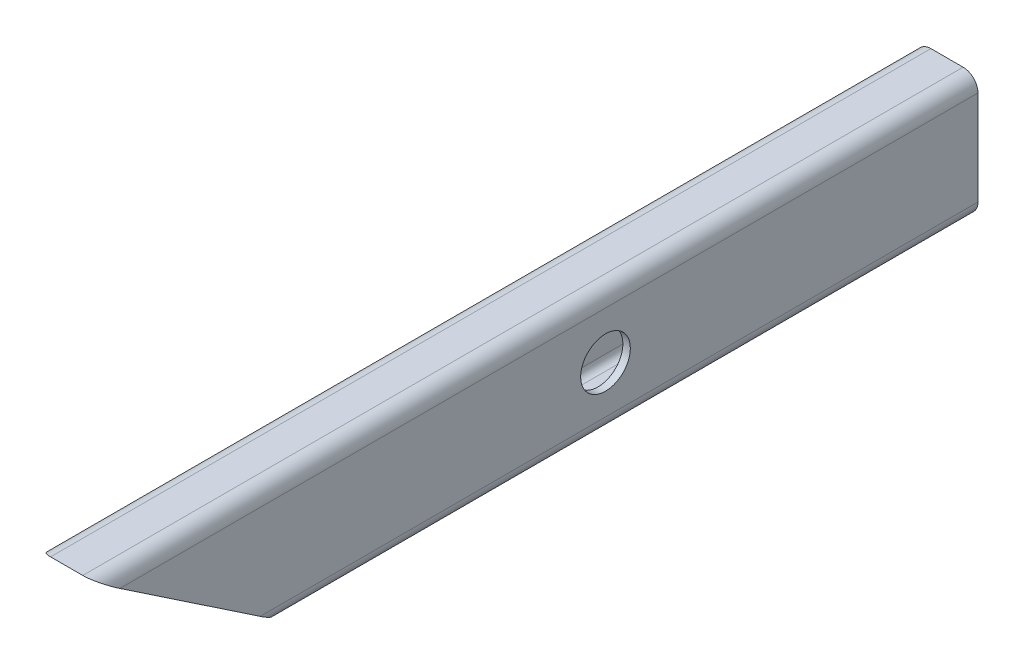
ISO-10303-21;
HEADER;
FILE_DESCRIPTION(('STEP AP214'),'2;1');
FILE_NAME('part.step','',(''),(''),'','','');
FILE_SCHEMA(('AUTOMOTIVE_DESIGN { 1 0 10303 214 1 1 1 1 }'));
ENDSEC;
DATA;
#1=APPLICATION_CONTEXT('core data for automotive mechanical design processes');
#2=APPLICATION_PROTOCOL_DEFINITION('international standard','automotive_design',2000,#1);
#3=PRODUCT_CONTEXT('',#1,'mechanical');
#4=PRODUCT('Part','Part','',(#3));
#5=PRODUCT_RELATED_PRODUCT_CATEGORY('part','',(#4));
#6=PRODUCT_DEFINITION_FORMATION('','',#4);
#7=PRODUCT_DEFINITION_CONTEXT('part definition',#1,'design');
#8=PRODUCT_DEFINITION('design','',#6,#7);
#9=PRODUCT_DEFINITION_SHAPE('','',#8);
#10=(LENGTH_UNIT() NAMED_UNIT(*) SI_UNIT(.MILLI.,.METRE.));
#11=(NAMED_UNIT(*) PLANE_ANGLE_UNIT() SI_UNIT($,.RADIAN.));
#12=(NAMED_UNIT(*) SI_UNIT($,.STERADIAN.) SOLID_ANGLE_UNIT());
#13=UNCERTAINTY_MEASURE_WITH_UNIT(LENGTH_MEASURE(1.E-05),#10,'distance_accuracy_value','');
#14=(GEOMETRIC_REPRESENTATION_CONTEXT(3) GLOBAL_UNCERTAINTY_ASSIGNED_CONTEXT((#13)) GLOBAL_UNIT_ASSIGNED_CONTEXT((#10,
#11,#12)) REPRESENTATION_CONTEXT('',''));
#15=CARTESIAN_POINT('',(0.,0.,0.));
#16=DIRECTION('',(0.,0.,1.));
#17=DIRECTION('',(1.,0.,0.));
#18=AXIS2_PLACEMENT_3D('',#15,#16,#17);
#19=CARTESIAN_POINT('',(6.,6.,356.5));
#20=DIRECTION('',(0.,0.,-1.));
#21=DIRECTION('',(-1.,0.,0.));
#22=AXIS2_PLACEMENT_3D('',#19,#20,#21);
#23=CYLINDRICAL_SURFACE('',#22,6.);
#24=CARTESIAN_POINT('',(6.,6.,289.040797450636));
#25=DIRECTION('',(0.,-0.829934558297363,0.557860761251193));
#26=DIRECTION('',(0.,-0.557860761251193,-0.829934558297364));
#27=AXIS2_PLACEMENT_3D('',#24,#25,#26);
#28=ELLIPSE('',#27,10.7553719794577,6.);
#29=CARTESIAN_POINT('',(0.,5.99999999999998,289.040797450636));
#30=VERTEX_POINT('',#29);
#31=CARTESIAN_POINT('',(6.,0.,280.114542557541));
#32=VERTEX_POINT('',#31);
#33=EDGE_CURVE('E266',#30,#32,#28,.T.);
#34=ORIENTED_EDGE('',*,*,#33,.F.);
#35=DIRECTION('',(0.,0.,-1.));
#36=VECTOR('',#35,1.);
#37=CARTESIAN_POINT('',(0.,6.,356.5));
#38=LINE('',#37,#36);
#39=CARTESIAN_POINT('',(0.,6.,0.));
#40=VERTEX_POINT('',#39);
#41=EDGE_CURVE('E206',#30,#40,#38,.T.);
#42=ORIENTED_EDGE('',*,*,#41,.T.);
#43=CARTESIAN_POINT('',(6.,6.,0.));
#44=DIRECTION('',(0.,0.,1.));
#45=DIRECTION('',(-1.,0.,0.));
#46=AXIS2_PLACEMENT_3D('',#43,#44,#45);
#47=CIRCLE('',#46,6.);
#48=CARTESIAN_POINT('',(6.,0.,0.));
#49=VERTEX_POINT('',#48);
#50=EDGE_CURVE('E201',#40,#49,#47,.T.);
#51=ORIENTED_EDGE('',*,*,#50,.T.);
#52=DIRECTION('',(0.,0.,-1.));
#53=VECTOR('',#52,1.);
#54=CARTESIAN_POINT('',(6.,0.,356.5));
#55=LINE('',#54,#53);
#56=EDGE_CURVE('E47',#32,#49,#55,.T.);
#57=ORIENTED_EDGE('',*,*,#56,.F.);
#58=EDGE_LOOP('',(#34,#42,#51,#57));
#59=FACE_BOUND('',#58,.T.);
#60=ADVANCED_FACE('F39',(#59),#23,.T.);
#61=CARTESIAN_POINT('',(6.,0.,356.5));
#62=DIRECTION('',(0.,1.,0.));
#63=DIRECTION('',(0.,0.,1.));
#64=AXIS2_PLACEMENT_3D('',#61,#62,#63);
#65=PLANE('',#64);
#66=DIRECTION('',(1.,0.,0.));
#67=VECTOR('',#66,1.);
#68=CARTESIAN_POINT('',(0.,0.,280.114542557541));
#69=LINE('',#68,#67);
#70=CARTESIAN_POINT('',(18.9611964303452,0.,280.114542557541));
#71=VERTEX_POINT('',#70);
#72=EDGE_CURVE('E192',#32,#71,#69,.T.);
#73=ORIENTED_EDGE('',*,*,#72,.F.);
#74=ORIENTED_EDGE('',*,*,#56,.T.);
#75=DIRECTION('',(1.,0.,0.));
#76=VECTOR('',#75,1.);
#77=CARTESIAN_POINT('',(6.,0.,0.));
#78=LINE('',#77,#76);
#79=CARTESIAN_POINT('',(18.9611964303452,0.,0.));
#80=VERTEX_POINT('',#79);
#81=EDGE_CURVE('E190',#49,#80,#78,.T.);
#82=ORIENTED_EDGE('',*,*,#81,.T.);
#83=DIRECTION('',(0.,0.,-1.));
#84=VECTOR('',#83,1.);
#85=CARTESIAN_POINT('',(18.9611964303452,0.,356.5));
#86=LINE('',#85,#84);
#87=EDGE_CURVE('E176',#71,#80,#86,.T.);
#88=ORIENTED_EDGE('',*,*,#87,.F.);
#89=EDGE_LOOP('',(#73,#74,#82,#88));
#90=FACE_BOUND('',#89,.T.);
#91=ADVANCED_FACE('F188',(#90),#65,.F.);
#92=CARTESIAN_POINT('',(18.9611964303452,6.,356.5));
#93=DIRECTION('',(0.,0.,-1.));
#94=DIRECTION('',(-1.,0.,0.));
#95=AXIS2_PLACEMENT_3D('',#92,#93,#94);
#96=CYLINDRICAL_SURFACE('',#95,6.);
#97=CARTESIAN_POINT('',(18.9611964303452,6.,289.040797450636));
#98=DIRECTION('',(0.,-0.829934558297363,0.557860761251193));
#99=DIRECTION('',(0.,-0.557860761251193,-0.829934558297364));
#100=AXIS2_PLACEMENT_3D('',#97,#98,#99);
#101=ELLIPSE('',#100,10.7553719794577,6.);
#102=CARTESIAN_POINT('',(24.9611964303452,5.99999999999998,289.040797450636));
#103=VERTEX_POINT('',#102);
#104=EDGE_CURVE('E155',#71,#103,#101,.T.);
#105=ORIENTED_EDGE('',*,*,#104,.F.);
#106=ORIENTED_EDGE('',*,*,#87,.T.);
#107=CARTESIAN_POINT('',(18.9611964303452,6.,0.));
#108=DIRECTION('',(0.,0.,1.));
#109=DIRECTION('',(1.,0.,0.));
#110=AXIS2_PLACEMENT_3D('',#107,#108,#109);
#111=CIRCLE('',#110,6.);
#112=CARTESIAN_POINT('',(24.9611964303452,6.,0.));
#113=VERTEX_POINT('',#112);
#114=EDGE_CURVE('E203',#80,#113,#111,.T.);
#115=ORIENTED_EDGE('',*,*,#114,.T.);
#116=DIRECTION('',(0.,0.,-1.));
#117=VECTOR('',#116,1.);
#118=CARTESIAN_POINT('',(24.9611964303452,6.,356.5));
#119=LINE('',#118,#117);
#120=EDGE_CURVE('E174',#103,#113,#119,.T.);
#121=ORIENTED_EDGE('',*,*,#120,.F.);
#122=EDGE_LOOP('',(#105,#106,#115,#121));
#123=FACE_BOUND('',#122,.T.);
#124=ADVANCED_FACE('F349',(#123),#96,.T.);
#125=CARTESIAN_POINT('',(24.9611964303453,44.,356.5));
#126=DIRECTION('',(-1.,0.,0.));
#127=DIRECTION('',(0.,-1.,0.));
#128=AXIS2_PLACEMENT_3D('',#125,#126,#127);
#129=PLANE('',#128);
#130=CARTESIAN_POINT('',(24.9611964303452,25.,150.));
#131=DIRECTION('',(1.,0.,0.));
#132=DIRECTION('',(0.,1.,0.));
#133=AXIS2_PLACEMENT_3D('',#130,#131,#132);
#134=CIRCLE('',#133,10.);
#135=CARTESIAN_POINT('',(24.9611964303453,35.,150.));
#136=VERTEX_POINT('',#135);
#137=EDGE_CURVE('E471',#136,#136,#134,.T.);
#138=ORIENTED_EDGE('',*,*,#137,.F.);
#139=EDGE_LOOP('',(#138));
#140=FACE_BOUND('',#139,.T.);
#141=DIRECTION('',(0.,-0.557860761251193,-0.829934558297364));
#142=VECTOR('',#141,1.);
#143=CARTESIAN_POINT('',(24.9611964303452,-129.689650675504,87.1740627365411));
#144=LINE('',#143,#142);
#145=CARTESIAN_POINT('',(24.9611964303453,44.0000000000001,345.573745106905));
#146=VERTEX_POINT('',#145);
#147=EDGE_CURVE('E149',#146,#103,#144,.T.);
#148=ORIENTED_EDGE('',*,*,#147,.T.);
#149=ORIENTED_EDGE('',*,*,#120,.T.);
#150=DIRECTION('',(0.,1.,0.));
#151=VECTOR('',#150,1.);
#152=CARTESIAN_POINT('',(24.9611964303453,44.,0.));
#153=LINE('',#152,#151);
#154=CARTESIAN_POINT('',(24.9611964303453,44.,0.));
#155=VERTEX_POINT('',#154);
#156=EDGE_CURVE('E172',#113,#155,#153,.T.);
#157=ORIENTED_EDGE('',*,*,#156,.T.);
#158=DIRECTION('',(0.,0.,-1.));
#159=VECTOR('',#158,1.);
#160=CARTESIAN_POINT('',(24.9611964303453,44.,356.5));
#161=LINE('',#160,#159);
#162=EDGE_CURVE('E166',#146,#155,#161,.T.);
#163=ORIENTED_EDGE('',*,*,#162,.F.);
#164=EDGE_LOOP('',(#148,#149,#157,#163));
#165=FACE_BOUND('',#164,.T.);
#166=ADVANCED_FACE('F170',(#140,#165),#129,.F.);
#167=CARTESIAN_POINT('',(18.9611964303452,44.,356.5));
#168=DIRECTION('',(0.,0.,-1.));
#169=DIRECTION('',(-1.,0.,0.));
#170=AXIS2_PLACEMENT_3D('',#167,#168,#169);
#171=CYLINDRICAL_SURFACE('',#170,6.00000000000001);
#172=CARTESIAN_POINT('',(18.9611964303452,44.,345.573745106905));
#173=DIRECTION('',(0.,-0.829934558297363,0.557860761251193));
#174=DIRECTION('',(0.,-0.557860761251193,-0.829934558297364));
#175=AXIS2_PLACEMENT_3D('',#172,#173,#174);
#176=ELLIPSE('',#175,10.7553719794577,6.00000000000001);
#177=CARTESIAN_POINT('',(18.9611964303453,50.,354.5));
#178=VERTEX_POINT('',#177);
#179=EDGE_CURVE('E152',#146,#178,#176,.T.);
#180=ORIENTED_EDGE('',*,*,#179,.F.);
#181=ORIENTED_EDGE('',*,*,#162,.T.);
#182=CARTESIAN_POINT('',(18.9611964303452,44.,0.));
#183=DIRECTION('',(0.,0.,1.));
#184=DIRECTION('',(-1.,0.,0.));
#185=AXIS2_PLACEMENT_3D('',#182,#183,#184);
#186=CIRCLE('',#185,6.00000000000001);
#187=CARTESIAN_POINT('',(18.9611964303452,50.,0.));
#188=VERTEX_POINT('',#187);
#189=EDGE_CURVE('E216',#155,#188,#186,.T.);
#190=ORIENTED_EDGE('',*,*,#189,.T.);
#191=DIRECTION('',(0.,0.,-1.));
#192=VECTOR('',#191,1.);
#193=CARTESIAN_POINT('',(18.9611964303452,50.,356.5));
#194=LINE('',#193,#192);
#195=EDGE_CURVE('E168',#178,#188,#194,.T.);
#196=ORIENTED_EDGE('',*,*,#195,.F.);
#197=EDGE_LOOP('',(#180,#181,#190,#196));
#198=FACE_BOUND('',#197,.T.);
#199=ADVANCED_FACE('F164',(#198),#171,.T.);
#200=CARTESIAN_POINT('',(6.,50.,356.5));
#201=DIRECTION('',(0.,-1.,0.));
#202=DIRECTION('',(0.,0.,-1.));
#203=AXIS2_PLACEMENT_3D('',#200,#201,#202);
#204=PLANE('',#203);
#205=DIRECTION('',(1.,0.,0.));
#206=VECTOR('',#205,1.);
#207=CARTESIAN_POINT('',(0.,50.,354.5));
#208=LINE('',#207,#206);
#209=CARTESIAN_POINT('',(6.,50.,354.5));
#210=VERTEX_POINT('',#209);
#211=EDGE_CURVE('E238',#210,#178,#208,.T.);
#212=ORIENTED_EDGE('',*,*,#211,.T.);
#213=ORIENTED_EDGE('',*,*,#195,.T.);
#214=DIRECTION('',(-1.,0.,0.));
#215=VECTOR('',#214,1.);
#216=CARTESIAN_POINT('',(6.,50.,0.));
#217=LINE('',#216,#215);
#218=CARTESIAN_POINT('',(6.,50.,0.));
#219=VERTEX_POINT('',#218);
#220=EDGE_CURVE('E218',#188,#219,#217,.T.);
#221=ORIENTED_EDGE('',*,*,#220,.T.);
#222=DIRECTION('',(0.,0.,-1.));
#223=VECTOR('',#222,1.);
#224=CARTESIAN_POINT('',(6.,50.,356.5));
#225=LINE('',#224,#223);
#226=EDGE_CURVE('E178',#210,#219,#225,.T.);
#227=ORIENTED_EDGE('',*,*,#226,.F.);
#228=EDGE_LOOP('',(#212,#213,#221,#227));
#229=FACE_BOUND('',#228,.T.);
#230=ADVANCED_FACE('F235',(#229),#204,.F.);
#231=CARTESIAN_POINT('',(6.,44.,356.5));
#232=DIRECTION('',(0.,0.,-1.));
#233=DIRECTION('',(-1.,0.,0.));
#234=AXIS2_PLACEMENT_3D('',#231,#232,#233);
#235=CYLINDRICAL_SURFACE('',#234,6.);
#236=CARTESIAN_POINT('',(6.,44.,345.573745106905));
#237=DIRECTION('',(0.,-0.829934558297363,0.557860761251193));
#238=DIRECTION('',(0.,-0.557860761251193,-0.829934558297364));
#239=AXIS2_PLACEMENT_3D('',#236,#237,#238);
#240=ELLIPSE('',#239,10.7553719794577,6.);
#241=CARTESIAN_POINT('',(0.,44.,345.573745106905));
#242=VERTEX_POINT('',#241);
#243=EDGE_CURVE('E54',#210,#242,#240,.T.);
#244=ORIENTED_EDGE('',*,*,#243,.F.);
#245=ORIENTED_EDGE('',*,*,#226,.T.);
#246=CARTESIAN_POINT('',(6.,44.,0.));
#247=DIRECTION('',(0.,0.,1.));
#248=DIRECTION('',(1.,0.,0.));
#249=AXIS2_PLACEMENT_3D('',#246,#247,#248);
#250=CIRCLE('',#249,6.);
#251=CARTESIAN_POINT('',(0.,44.,0.));
#252=VERTEX_POINT('',#251);
#253=EDGE_CURVE('E221',#219,#252,#250,.T.);
#254=ORIENTED_EDGE('',*,*,#253,.T.);
#255=DIRECTION('',(0.,0.,-1.));
#256=VECTOR('',#255,1.);
#257=CARTESIAN_POINT('',(0.,44.,356.5));
#258=LINE('',#257,#256);
#259=EDGE_CURVE('E227',#242,#252,#258,.T.);
#260=ORIENTED_EDGE('',*,*,#259,.F.);
#261=EDGE_LOOP('',(#244,#245,#254,#260));
#262=FACE_BOUND('',#261,.T.);
#263=ADVANCED_FACE('F230',(#262),#235,.T.);
#264=CARTESIAN_POINT('',(0.,44.,356.5));
#265=DIRECTION('',(1.,0.,0.));
#266=DIRECTION('',(0.,0.,-1.));
#267=AXIS2_PLACEMENT_3D('',#264,#265,#266);
#268=PLANE('',#267);
#269=CARTESIAN_POINT('',(0.,25.,150.));
#270=DIRECTION('',(1.,0.,0.));
#271=DIRECTION('',(0.,1.,0.));
#272=AXIS2_PLACEMENT_3D('',#269,#270,#271);
#273=CIRCLE('',#272,10.);
#274=CARTESIAN_POINT('',(0.,35.,150.));
#275=VERTEX_POINT('',#274);
#276=EDGE_CURVE('E472',#275,#275,#273,.T.);
#277=ORIENTED_EDGE('',*,*,#276,.T.);
#278=EDGE_LOOP('',(#277));
#279=FACE_BOUND('',#278,.T.);
#280=DIRECTION('',(0.,-0.557860761251193,-0.829934558297364));
#281=VECTOR('',#280,1.);
#282=CARTESIAN_POINT('',(0.,-129.689650675504,87.1740627365411));
#283=LINE('',#282,#281);
#284=EDGE_CURVE('E159',#242,#30,#283,.T.);
#285=ORIENTED_EDGE('',*,*,#284,.F.);
#286=ORIENTED_EDGE('',*,*,#259,.T.);
#287=DIRECTION('',(0.,-1.,0.));
#288=VECTOR('',#287,1.);
#289=CARTESIAN_POINT('',(0.,44.,0.));
#290=LINE('',#289,#288);
#291=EDGE_CURVE('E224',#252,#40,#290,.T.);
#292=ORIENTED_EDGE('',*,*,#291,.T.);
#293=ORIENTED_EDGE('',*,*,#41,.F.);
#294=EDGE_LOOP('',(#285,#286,#292,#293));
#295=FACE_BOUND('',#294,.T.);
#296=ADVANCED_FACE('F237',(#279,#295),#268,.F.);
#297=CARTESIAN_POINT('',(6.,6.,356.5));
#298=DIRECTION('',(0.,0.,-1.));
#299=DIRECTION('',(-1.,0.,0.));
#300=AXIS2_PLACEMENT_3D('',#297,#298,#299);
#301=CYLINDRICAL_SURFACE('',#300,3.);
#302=DIRECTION('',(0.,0.,-1.));
#303=VECTOR('',#302,1.);
#304=CARTESIAN_POINT('',(3.,6.,356.5));
#305=LINE('',#304,#303);
#306=CARTESIAN_POINT('',(3.,6.,289.040797450636));
#307=VERTEX_POINT('',#306);
#308=CARTESIAN_POINT('',(3.,6.,0.));
#309=VERTEX_POINT('',#308);
#310=EDGE_CURVE('E292',#307,#309,#305,.T.);
#311=ORIENTED_EDGE('',*,*,#310,.F.);
#312=CARTESIAN_POINT('',(6.,6.,289.040797450636));
#313=DIRECTION('',(0.,-0.829934558297363,0.557860761251193));
#314=DIRECTION('',(0.,-0.557860761251193,-0.829934558297364));
#315=AXIS2_PLACEMENT_3D('',#312,#313,#314);
#316=ELLIPSE('',#315,5.37768598972883,3.);
#317=CARTESIAN_POINT('',(6.,3.,284.577670004089));
#318=VERTEX_POINT('',#317);
#319=EDGE_CURVE('E62',#307,#318,#316,.T.);
#320=ORIENTED_EDGE('',*,*,#319,.T.);
#321=DIRECTION('',(0.,0.,-1.));
#322=VECTOR('',#321,1.);
#323=CARTESIAN_POINT('',(6.,3.,356.5));
#324=LINE('',#323,#322);
#325=CARTESIAN_POINT('',(6.,3.,0.));
#326=VERTEX_POINT('',#325);
#327=EDGE_CURVE('E208',#318,#326,#324,.T.);
#328=ORIENTED_EDGE('',*,*,#327,.T.);
#329=CARTESIAN_POINT('',(6.,6.,0.));
#330=DIRECTION('',(0.,0.,1.));
#331=DIRECTION('',(-1.,0.,0.));
#332=AXIS2_PLACEMENT_3D('',#329,#330,#331);
#333=CIRCLE('',#332,3.);
#334=EDGE_CURVE('E268',#309,#326,#333,.T.);
#335=ORIENTED_EDGE('',*,*,#334,.F.);
#336=EDGE_LOOP('',(#311,#320,#328,#335));
#337=FACE_BOUND('',#336,.T.);
#338=ADVANCED_FACE('F317',(#337),#301,.F.);
#339=CARTESIAN_POINT('',(6.,3.,356.5));
#340=DIRECTION('',(0.,1.,0.));
#341=DIRECTION('',(0.,0.,1.));
#342=AXIS2_PLACEMENT_3D('',#339,#340,#341);
#343=PLANE('',#342);
#344=ORIENTED_EDGE('',*,*,#327,.F.);
#345=DIRECTION('',(1.,0.,0.));
#346=VECTOR('',#345,1.);
#347=CARTESIAN_POINT('',(6.00000000000002,3.,284.577670004089));
#348=LINE('',#347,#346);
#349=CARTESIAN_POINT('',(18.9611964303452,3.,284.577670004089));
#350=VERTEX_POINT('',#349);
#351=EDGE_CURVE('E260',#318,#350,#348,.T.);
#352=ORIENTED_EDGE('',*,*,#351,.T.);
#353=DIRECTION('',(0.,0.,-1.));
#354=VECTOR('',#353,1.);
#355=CARTESIAN_POINT('',(18.9611964303452,3.,356.5));
#356=LINE('',#355,#354);
#357=CARTESIAN_POINT('',(18.9611964303452,3.,0.));
#358=VERTEX_POINT('',#357);
#359=EDGE_CURVE('E210',#350,#358,#356,.T.);
#360=ORIENTED_EDGE('',*,*,#359,.T.);
#361=DIRECTION('',(1.,0.,0.));
#362=VECTOR('',#361,1.);
#363=CARTESIAN_POINT('',(6.,3.,0.));
#364=LINE('',#363,#362);
#365=EDGE_CURVE('E271',#326,#358,#364,.T.);
#366=ORIENTED_EDGE('',*,*,#365,.F.);
#367=EDGE_LOOP('',(#344,#352,#360,#366));
#368=FACE_BOUND('',#367,.T.);
#369=ADVANCED_FACE('F308',(#368),#343,.T.);
#370=CARTESIAN_POINT('',(18.9611964303452,6.,356.5));
#371=DIRECTION('',(0.,0.,-1.));
#372=DIRECTION('',(-1.,0.,0.));
#373=AXIS2_PLACEMENT_3D('',#370,#371,#372);
#374=CYLINDRICAL_SURFACE('',#373,3.);
#375=ORIENTED_EDGE('',*,*,#359,.F.);
#376=CARTESIAN_POINT('',(18.9611964303452,6.,289.040797450636));
#377=DIRECTION('',(0.,-0.829934558297363,0.557860761251193));
#378=DIRECTION('',(0.,-0.557860761251193,-0.829934558297364));
#379=AXIS2_PLACEMENT_3D('',#376,#377,#378);
#380=ELLIPSE('',#379,5.37768598972883,3.);
#381=CARTESIAN_POINT('',(21.9611964303452,6.00000000000001,289.040797450636));
#382=VERTEX_POINT('',#381);
#383=EDGE_CURVE('E257',#350,#382,#380,.T.);
#384=ORIENTED_EDGE('',*,*,#383,.T.);
#385=DIRECTION('',(0.,0.,-1.));
#386=VECTOR('',#385,1.);
#387=CARTESIAN_POINT('',(21.9611964303452,6.,356.5));
#388=LINE('',#387,#386);
#389=CARTESIAN_POINT('',(21.9611964303452,6.,0.));
#390=VERTEX_POINT('',#389);
#391=EDGE_CURVE('E302',#382,#390,#388,.T.);
#392=ORIENTED_EDGE('',*,*,#391,.T.);
#393=CARTESIAN_POINT('',(18.9611964303452,6.,0.));
#394=DIRECTION('',(0.,0.,1.));
#395=DIRECTION('',(1.,0.,0.));
#396=AXIS2_PLACEMENT_3D('',#393,#394,#395);
#397=CIRCLE('',#396,3.);
#398=EDGE_CURVE('E274',#358,#390,#397,.T.);
#399=ORIENTED_EDGE('',*,*,#398,.F.);
#400=EDGE_LOOP('',(#375,#384,#392,#399));
#401=FACE_BOUND('',#400,.T.);
#402=ADVANCED_FACE('F310',(#401),#374,.F.);
#403=CARTESIAN_POINT('',(21.9611964303452,44.,356.5));
#404=DIRECTION('',(-1.,0.,0.));
#405=DIRECTION('',(0.,0.,1.));
#406=AXIS2_PLACEMENT_3D('',#403,#404,#405);
#407=PLANE('',#406);
#408=CARTESIAN_POINT('',(21.9611964303452,25.,150.));
#409=DIRECTION('',(-1.,0.,0.));
#410=DIRECTION('',(0.,0.,1.));
#411=AXIS2_PLACEMENT_3D('',#408,#409,#410);
#412=CIRCLE('',#411,10.);
#413=CARTESIAN_POINT('',(21.9611964303452,25.,160.));
#414=VERTEX_POINT('',#413);
#415=EDGE_CURVE('E160',#414,#414,#412,.T.);
#416=ORIENTED_EDGE('',*,*,#415,.F.);
#417=EDGE_LOOP('',(#416));
#418=FACE_BOUND('',#417,.T.);
#419=ORIENTED_EDGE('',*,*,#391,.F.);
#420=DIRECTION('',(0.,0.557860761251193,0.829934558297363));
#421=VECTOR('',#420,1.);
#422=CARTESIAN_POINT('',(21.9611964303452,49.0587240752983,353.09965519523));
#423=LINE('',#422,#421);
#424=CARTESIAN_POINT('',(21.9611964303452,44.,345.573745106905));
#425=VERTEX_POINT('',#424);
#426=EDGE_CURVE('E254',#382,#425,#423,.T.);
#427=ORIENTED_EDGE('',*,*,#426,.T.);
#428=DIRECTION('',(0.,0.,-1.));
#429=VECTOR('',#428,1.);
#430=CARTESIAN_POINT('',(21.9611964303452,44.,356.5));
#431=LINE('',#430,#429);
#432=CARTESIAN_POINT('',(21.9611964303452,44.,0.));
#433=VERTEX_POINT('',#432);
#434=EDGE_CURVE('E300',#425,#433,#431,.T.);
#435=ORIENTED_EDGE('',*,*,#434,.T.);
#436=DIRECTION('',(0.,1.,0.));
#437=VECTOR('',#436,1.);
#438=CARTESIAN_POINT('',(21.9611964303452,44.,0.));
#439=LINE('',#438,#437);
#440=EDGE_CURVE('E277',#390,#433,#439,.T.);
#441=ORIENTED_EDGE('',*,*,#440,.F.);
#442=EDGE_LOOP('',(#419,#427,#435,#441));
#443=FACE_BOUND('',#442,.T.);
#444=ADVANCED_FACE('F334',(#418,#443),#407,.T.);
#445=CARTESIAN_POINT('',(18.9611964303452,44.,356.5));
#446=DIRECTION('',(0.,0.,-1.));
#447=DIRECTION('',(-1.,0.,0.));
#448=AXIS2_PLACEMENT_3D('',#445,#446,#447);
#449=CYLINDRICAL_SURFACE('',#448,3.);
#450=ORIENTED_EDGE('',*,*,#434,.F.);
#451=CARTESIAN_POINT('',(18.9611964303452,44.,345.573745106905));
#452=DIRECTION('',(0.,-0.829934558297363,0.557860761251193));
#453=DIRECTION('',(0.,-0.557860761251193,-0.829934558297364));
#454=AXIS2_PLACEMENT_3D('',#451,#452,#453);
#455=ELLIPSE('',#454,5.37768598972883,3.);
#456=CARTESIAN_POINT('',(18.9611964303452,47.,350.036872553452));
#457=VERTEX_POINT('',#456);
#458=EDGE_CURVE('E251',#425,#457,#455,.T.);
#459=ORIENTED_EDGE('',*,*,#458,.T.);
#460=DIRECTION('',(0.,0.,-1.));
#461=VECTOR('',#460,1.);
#462=CARTESIAN_POINT('',(18.9611964303452,47.,356.5));
#463=LINE('',#462,#461);
#464=CARTESIAN_POINT('',(18.9611964303452,47.,0.));
#465=VERTEX_POINT('',#464);
#466=EDGE_CURVE('E298',#457,#465,#463,.T.);
#467=ORIENTED_EDGE('',*,*,#466,.T.);
#468=CARTESIAN_POINT('',(18.9611964303452,44.,0.));
#469=DIRECTION('',(0.,0.,1.));
#470=DIRECTION('',(-1.,0.,0.));
#471=AXIS2_PLACEMENT_3D('',#468,#469,#470);
#472=CIRCLE('',#471,3.);
#473=EDGE_CURVE('E280',#433,#465,#472,.T.);
#474=ORIENTED_EDGE('',*,*,#473,.F.);
#475=EDGE_LOOP('',(#450,#459,#467,#474));
#476=FACE_BOUND('',#475,.T.);
#477=ADVANCED_FACE('F331',(#476),#449,.F.);
#478=CARTESIAN_POINT('',(6.,47.,356.5));
#479=DIRECTION('',(0.,-1.,0.));
#480=DIRECTION('',(0.,0.,-1.));
#481=AXIS2_PLACEMENT_3D('',#478,#479,#480);
#482=PLANE('',#481);
#483=ORIENTED_EDGE('',*,*,#466,.F.);
#484=DIRECTION('',(-1.,0.,0.));
#485=VECTOR('',#484,1.);
#486=CARTESIAN_POINT('',(6.,47.,350.036872553452));
#487=LINE('',#486,#485);
#488=CARTESIAN_POINT('',(6.,47.,350.036872553452));
#489=VERTEX_POINT('',#488);
#490=EDGE_CURVE('E248',#457,#489,#487,.T.);
#491=ORIENTED_EDGE('',*,*,#490,.T.);
#492=DIRECTION('',(0.,0.,-1.));
#493=VECTOR('',#492,1.);
#494=CARTESIAN_POINT('',(6.,47.,356.5));
#495=LINE('',#494,#493);
#496=CARTESIAN_POINT('',(6.,47.,0.));
#497=VERTEX_POINT('',#496);
#498=EDGE_CURVE('E296',#489,#497,#495,.T.);
#499=ORIENTED_EDGE('',*,*,#498,.T.);
#500=DIRECTION('',(-1.,0.,0.));
#501=VECTOR('',#500,1.);
#502=CARTESIAN_POINT('',(6.,47.,0.));
#503=LINE('',#502,#501);
#504=EDGE_CURVE('E283',#465,#497,#503,.T.);
#505=ORIENTED_EDGE('',*,*,#504,.F.);
#506=EDGE_LOOP('',(#483,#491,#499,#505));
#507=FACE_BOUND('',#506,.T.);
#508=ADVANCED_FACE('F328',(#507),#482,.T.);
#509=CARTESIAN_POINT('',(6.,44.,356.5));
#510=DIRECTION('',(0.,0.,-1.));
#511=DIRECTION('',(-1.,0.,0.));
#512=AXIS2_PLACEMENT_3D('',#509,#510,#511);
#513=CYLINDRICAL_SURFACE('',#512,3.);
#514=ORIENTED_EDGE('',*,*,#498,.F.);
#515=CARTESIAN_POINT('',(6.,44.,345.573745106905));
#516=DIRECTION('',(0.,-0.829934558297363,0.557860761251193));
#517=DIRECTION('',(0.,-0.557860761251193,-0.829934558297364));
#518=AXIS2_PLACEMENT_3D('',#515,#516,#517);
#519=ELLIPSE('',#518,5.37768598972883,3.);
#520=CARTESIAN_POINT('',(3.,44.,345.573745106905));
#521=VERTEX_POINT('',#520);
#522=EDGE_CURVE('E244',#489,#521,#519,.T.);
#523=ORIENTED_EDGE('',*,*,#522,.T.);
#524=DIRECTION('',(0.,0.,-1.));
#525=VECTOR('',#524,1.);
#526=CARTESIAN_POINT('',(3.,44.,356.5));
#527=LINE('',#526,#525);
#528=CARTESIAN_POINT('',(3.,44.,0.));
#529=VERTEX_POINT('',#528);
#530=EDGE_CURVE('E294',#521,#529,#527,.T.);
#531=ORIENTED_EDGE('',*,*,#530,.T.);
#532=CARTESIAN_POINT('',(6.,44.,0.));
#533=DIRECTION('',(0.,0.,1.));
#534=DIRECTION('',(1.,0.,0.));
#535=AXIS2_PLACEMENT_3D('',#532,#533,#534);
#536=CIRCLE('',#535,3.);
#537=EDGE_CURVE('E286',#497,#529,#536,.T.);
#538=ORIENTED_EDGE('',*,*,#537,.F.);
#539=EDGE_LOOP('',(#514,#523,#531,#538));
#540=FACE_BOUND('',#539,.T.);
#541=ADVANCED_FACE('F323',(#540),#513,.F.);
#542=CARTESIAN_POINT('',(3.,44.,356.5));
#543=DIRECTION('',(1.,0.,0.));
#544=DIRECTION('',(0.,0.,-1.));
#545=AXIS2_PLACEMENT_3D('',#542,#543,#544);
#546=PLANE('',#545);
#547=CARTESIAN_POINT('',(3.,25.,150.));
#548=DIRECTION('',(1.,0.,0.));
#549=DIRECTION('',(0.,0.,-1.));
#550=AXIS2_PLACEMENT_3D('',#547,#548,#549);
#551=CIRCLE('',#550,10.);
#552=CARTESIAN_POINT('',(3.,25.,140.));
#553=VERTEX_POINT('',#552);
#554=EDGE_CURVE('E42',#553,#553,#551,.T.);
#555=ORIENTED_EDGE('',*,*,#554,.F.);
#556=EDGE_LOOP('',(#555));
#557=FACE_BOUND('',#556,.T.);
#558=ORIENTED_EDGE('',*,*,#530,.F.);
#559=DIRECTION('',(0.,-0.557860761251193,-0.829934558297363));
#560=VECTOR('',#559,1.);
#561=CARTESIAN_POINT('',(3.,49.0587240752983,353.09965519523));
#562=LINE('',#561,#560);
#563=EDGE_CURVE('E11',#521,#307,#562,.T.);
#564=ORIENTED_EDGE('',*,*,#563,.T.);
#565=ORIENTED_EDGE('',*,*,#310,.T.);
#566=DIRECTION('',(0.,-1.,0.));
#567=VECTOR('',#566,1.);
#568=CARTESIAN_POINT('',(3.,44.,0.));
#569=LINE('',#568,#567);
#570=EDGE_CURVE('E289',#529,#309,#569,.T.);
#571=ORIENTED_EDGE('',*,*,#570,.F.);
#572=EDGE_LOOP('',(#558,#564,#565,#571));
#573=FACE_BOUND('',#572,.T.);
#574=ADVANCED_FACE('F320',(#557,#573),#546,.T.);
#575=CARTESIAN_POINT('',(6.,6.,0.));
#576=DIRECTION('',(0.,0.,-1.));
#577=DIRECTION('',(-1.,0.,0.));
#578=AXIS2_PLACEMENT_3D('',#575,#576,#577);
#579=PLANE('',#578);
#580=ORIENTED_EDGE('',*,*,#50,.F.);
#581=ORIENTED_EDGE('',*,*,#291,.F.);
#582=ORIENTED_EDGE('',*,*,#253,.F.);
#583=ORIENTED_EDGE('',*,*,#220,.F.);
#584=ORIENTED_EDGE('',*,*,#189,.F.);
#585=ORIENTED_EDGE('',*,*,#156,.F.);
#586=ORIENTED_EDGE('',*,*,#114,.F.);
#587=ORIENTED_EDGE('',*,*,#81,.F.);
#588=EDGE_LOOP('',(#580,#581,#582,#583,#584,#585,#586,#587));
#589=FACE_BOUND('',#588,.T.);
#590=ORIENTED_EDGE('',*,*,#570,.T.);
#591=ORIENTED_EDGE('',*,*,#334,.T.);
#592=ORIENTED_EDGE('',*,*,#365,.T.);
#593=ORIENTED_EDGE('',*,*,#398,.T.);
#594=ORIENTED_EDGE('',*,*,#440,.T.);
#595=ORIENTED_EDGE('',*,*,#473,.T.);
#596=ORIENTED_EDGE('',*,*,#504,.T.);
#597=ORIENTED_EDGE('',*,*,#537,.T.);
#598=EDGE_LOOP('',(#590,#591,#592,#593,#594,#595,#596,#597));
#599=FACE_BOUND('',#598,.T.);
#600=ADVANCED_FACE('F198',(#589,#599),#579,.T.);
#601=CARTESIAN_POINT('',(0.,-129.689650675504,87.1740627365411));
#602=DIRECTION('',(0.,-0.829934558297363,0.557860761251193));
#603=DIRECTION('',(0.,-0.557860761251193,-0.829934558297364));
#604=AXIS2_PLACEMENT_3D('',#601,#602,#603);
#605=PLANE('',#604);
#606=ORIENTED_EDGE('',*,*,#563,.F.);
#607=ORIENTED_EDGE('',*,*,#522,.F.);
#608=ORIENTED_EDGE('',*,*,#490,.F.);
#609=ORIENTED_EDGE('',*,*,#458,.F.);
#610=ORIENTED_EDGE('',*,*,#426,.F.);
#611=ORIENTED_EDGE('',*,*,#383,.F.);
#612=ORIENTED_EDGE('',*,*,#351,.F.);
#613=ORIENTED_EDGE('',*,*,#319,.F.);
#614=EDGE_LOOP('',(#606,#607,#608,#609,#610,#611,#612,#613));
#615=FACE_BOUND('',#614,.T.);
#616=ORIENTED_EDGE('',*,*,#33,.T.);
#617=ORIENTED_EDGE('',*,*,#72,.T.);
#618=ORIENTED_EDGE('',*,*,#104,.T.);
#619=ORIENTED_EDGE('',*,*,#147,.F.);
#620=ORIENTED_EDGE('',*,*,#179,.T.);
#621=ORIENTED_EDGE('',*,*,#211,.F.);
#622=ORIENTED_EDGE('',*,*,#243,.T.);
#623=ORIENTED_EDGE('',*,*,#284,.T.);
#624=EDGE_LOOP('',(#616,#617,#618,#619,#620,#621,#622,#623));
#625=FACE_BOUND('',#624,.T.);
#626=ADVANCED_FACE('F151',(#615,#625),#605,.T.);
#627=CARTESIAN_POINT('',(0.,25.,150.));
#628=DIRECTION('',(1.,0.,0.));
#629=DIRECTION('',(0.,1.,0.));
#630=AXIS2_PLACEMENT_3D('',#627,#628,#629);
#631=CYLINDRICAL_SURFACE('',#630,10.);
#632=ORIENTED_EDGE('',*,*,#554,.T.);
#633=EDGE_LOOP('',(#632));
#634=FACE_BOUND('',#633,.T.);
#635=ORIENTED_EDGE('',*,*,#276,.F.);
#636=EDGE_LOOP('',(#635));
#637=FACE_BOUND('',#636,.T.);
#638=ADVANCED_FACE('F415',(#634,#637),#631,.F.);
#639=ORIENTED_EDGE('',*,*,#415,.T.);
#640=EDGE_LOOP('',(#639));
#641=FACE_BOUND('',#640,.T.);
#642=ORIENTED_EDGE('',*,*,#137,.T.);
#643=EDGE_LOOP('',(#642));
#644=FACE_BOUND('',#643,.T.);
#645=ADVANCED_FACE('F454',(#641,#644),#631,.F.);
#646=CLOSED_SHELL('',(#60,#91,#124,#166,#199,#230,#263,#296,#338,#369,#402,#444,#477,#508,#541,
#574,#600,#626,#638,#645));
#647=MANIFOLD_SOLID_BREP('B2',#646);
#648=ADVANCED_BREP_SHAPE_REPRESENTATION('',(#18,#647),#14);
#649=SHAPE_DEFINITION_REPRESENTATION(#9,#648);
ENDSEC;
END-ISO-10303-21;
